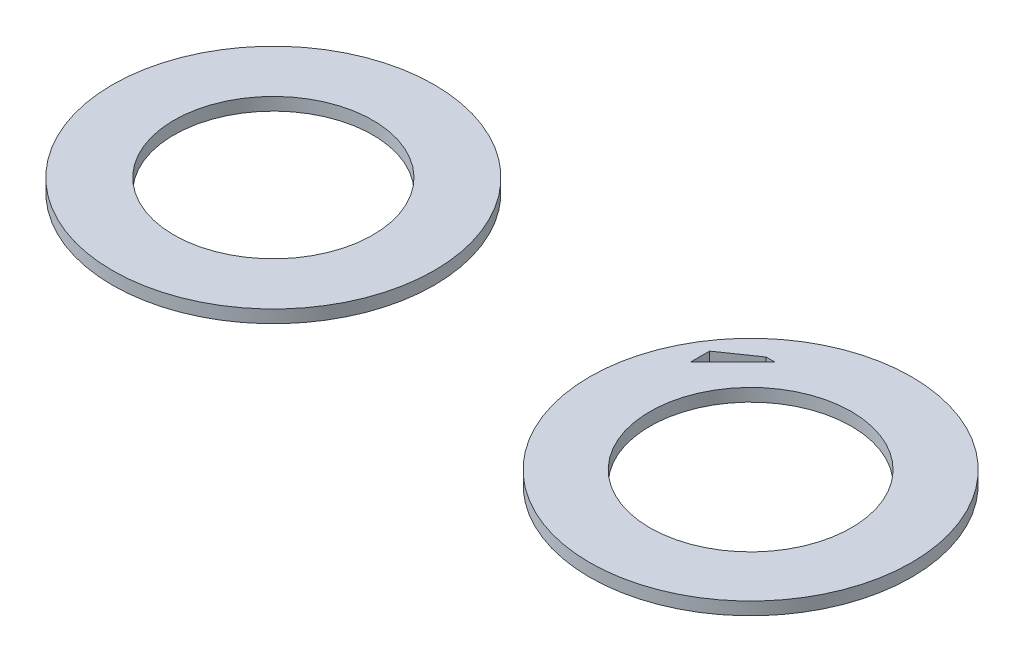
ISO-10303-21;
HEADER;
FILE_DESCRIPTION(('STEP AP214'),'2;1');
FILE_NAME('part.step','',(''),(''),'','','');
FILE_SCHEMA(('AUTOMOTIVE_DESIGN { 1 0 10303 214 1 1 1 1 }'));
ENDSEC;
DATA;
#1=APPLICATION_CONTEXT('core data for automotive mechanical design processes');
#2=APPLICATION_PROTOCOL_DEFINITION('international standard','automotive_design',2000,#1);
#3=PRODUCT_CONTEXT('',#1,'mechanical');
#4=PRODUCT('Part','Part','',(#3));
#5=PRODUCT_RELATED_PRODUCT_CATEGORY('part','',(#4));
#6=PRODUCT_DEFINITION_FORMATION('','',#4);
#7=PRODUCT_DEFINITION_CONTEXT('part definition',#1,'design');
#8=PRODUCT_DEFINITION('design','',#6,#7);
#9=PRODUCT_DEFINITION_SHAPE('','',#8);
#10=(LENGTH_UNIT() NAMED_UNIT(*) SI_UNIT(.MILLI.,.METRE.));
#11=(NAMED_UNIT(*) PLANE_ANGLE_UNIT() SI_UNIT($,.RADIAN.));
#12=(NAMED_UNIT(*) SI_UNIT($,.STERADIAN.) SOLID_ANGLE_UNIT());
#13=UNCERTAINTY_MEASURE_WITH_UNIT(LENGTH_MEASURE(1.E-05),#10,'distance_accuracy_value','');
#14=(GEOMETRIC_REPRESENTATION_CONTEXT(3) GLOBAL_UNCERTAINTY_ASSIGNED_CONTEXT((#13)) GLOBAL_UNIT_ASSIGNED_CONTEXT((#10,
#11,#12)) REPRESENTATION_CONTEXT('',''));
#15=CARTESIAN_POINT('',(0.,0.,0.));
#16=DIRECTION('',(0.,0.,1.));
#17=DIRECTION('',(1.,0.,0.));
#18=AXIS2_PLACEMENT_3D('',#15,#16,#17);
#19=CARTESIAN_POINT('',(52.3767748142269,2.5,-9.29666652388456));
#20=DIRECTION('',(0.,1.,0.));
#21=DIRECTION('',(0.,0.,1.));
#22=AXIS2_PLACEMENT_3D('',#19,#20,#21);
#23=PLANE('',#22);
#24=CARTESIAN_POINT('',(52.3767748142269,2.5,-9.29666652388456));
#25=DIRECTION('',(0.,1.,0.));
#26=DIRECTION('',(0.,0.,1.));
#27=AXIS2_PLACEMENT_3D('',#24,#25,#26);
#28=CIRCLE('',#27,31.55);
#29=CARTESIAN_POINT('',(52.3767748142269,2.5,22.2533334761154));
#30=VERTEX_POINT('',#29);
#31=EDGE_CURVE('E12',#30,#30,#28,.T.);
#32=ORIENTED_EDGE('',*,*,#31,.T.);
#33=EDGE_LOOP('',(#32));
#34=FACE_BOUND('',#33,.T.);
#35=CARTESIAN_POINT('',(52.3767748142269,2.5,-9.29666652388456));
#36=DIRECTION('',(0.,1.,0.));
#37=DIRECTION('',(0.,0.,1.));
#38=AXIS2_PLACEMENT_3D('',#35,#36,#37);
#39=CIRCLE('',#38,19.75);
#40=CARTESIAN_POINT('',(52.3767748142269,2.5,10.4533334761154));
#41=VERTEX_POINT('',#40);
#42=EDGE_CURVE('E141',#41,#41,#39,.T.);
#43=ORIENTED_EDGE('',*,*,#42,.F.);
#44=EDGE_LOOP('',(#43));
#45=FACE_BOUND('',#44,.T.);
#46=DIRECTION('',(0.,0.,1.));
#47=VECTOR('',#46,1.);
#48=CARTESIAN_POINT('',(28.2154295360468,2.5,-25.4042300426713));
#49=LINE('',#48,#47);
#50=CARTESIAN_POINT('',(28.2154295360468,2.5,-25.4042300426713));
#51=VERTEX_POINT('',#50);
#52=CARTESIAN_POINT('',(28.2154295360468,2.5,-21.6290198429557));
#53=VERTEX_POINT('',#52);
#54=EDGE_CURVE('E102',#51,#53,#49,.T.);
#55=ORIENTED_EDGE('',*,*,#54,.F.);
#56=DIRECTION('',(-0.82219219164377,0.,0.56920997883032));
#57=VECTOR('',#56,1.);
#58=CARTESIAN_POINT('',(34.7591272155539,2.5,-29.9344822823302));
#59=LINE('',#58,#57);
#60=CARTESIAN_POINT('',(34.7591272155539,2.5,-29.9344822823302));
#61=VERTEX_POINT('',#60);
#62=EDGE_CURVE('E93',#61,#51,#59,.T.);
#63=ORIENTED_EDGE('',*,*,#62,.F.);
#64=DIRECTION('',(-1.,0.,0.));
#65=VECTOR('',#64,1.);
#66=CARTESIAN_POINT('',(36.520891975421,2.5,-29.9344822823302));
#67=LINE('',#66,#65);
#68=CARTESIAN_POINT('',(36.520891975421,2.5,-29.9344822823302));
#69=VERTEX_POINT('',#68);
#70=EDGE_CURVE('E121',#69,#61,#67,.T.);
#71=ORIENTED_EDGE('',*,*,#70,.F.);
#72=DIRECTION('',(0.707106781186533,0.,-0.707106781186561));
#73=VECTOR('',#72,1.);
#74=CARTESIAN_POINT('',(28.2154295360468,2.5,-21.6290198429557));
#75=LINE('',#74,#73);
#76=EDGE_CURVE('E115',#53,#69,#75,.T.);
#77=ORIENTED_EDGE('',*,*,#76,.F.);
#78=EDGE_LOOP('',(#55,#63,#71,#77));
#79=FACE_BOUND('',#78,.T.);
#80=ADVANCED_FACE('F51',(#34,#45,#79),#23,.T.);
#81=CARTESIAN_POINT('',(52.3767748142269,0.,-9.29666652388456));
#82=DIRECTION('',(0.,1.,0.));
#83=DIRECTION('',(0.,0.,1.));
#84=AXIS2_PLACEMENT_3D('',#81,#82,#83);
#85=PLANE('',#84);
#86=CARTESIAN_POINT('',(52.3767748142269,0.,-9.29666652388456));
#87=DIRECTION('',(0.,1.,0.));
#88=DIRECTION('',(0.,0.,1.));
#89=AXIS2_PLACEMENT_3D('',#86,#87,#88);
#90=CIRCLE('',#89,19.75);
#91=CARTESIAN_POINT('',(52.3767748142269,0.,10.4533334761154));
#92=VERTEX_POINT('',#91);
#93=EDGE_CURVE('E111',#92,#92,#90,.T.);
#94=ORIENTED_EDGE('',*,*,#93,.T.);
#95=EDGE_LOOP('',(#94));
#96=FACE_BOUND('',#95,.T.);
#97=CARTESIAN_POINT('',(52.3767748142269,0.,-9.29666652388456));
#98=DIRECTION('',(0.,1.,0.));
#99=DIRECTION('',(0.,0.,1.));
#100=AXIS2_PLACEMENT_3D('',#97,#98,#99);
#101=CIRCLE('',#100,31.55);
#102=CARTESIAN_POINT('',(52.3767748142269,0.,22.2533334761154));
#103=VERTEX_POINT('',#102);
#104=EDGE_CURVE('E55',#103,#103,#101,.T.);
#105=ORIENTED_EDGE('',*,*,#104,.F.);
#106=EDGE_LOOP('',(#105));
#107=FACE_BOUND('',#106,.T.);
#108=DIRECTION('',(-0.82219219164377,0.,0.56920997883032));
#109=VECTOR('',#108,1.);
#110=CARTESIAN_POINT('',(34.7591272155539,0.,-29.9344822823302));
#111=LINE('',#110,#109);
#112=CARTESIAN_POINT('',(34.7591272155539,0.,-29.9344822823302));
#113=VERTEX_POINT('',#112);
#114=CARTESIAN_POINT('',(28.2154295360468,0.,-25.4042300426713));
#115=VERTEX_POINT('',#114);
#116=EDGE_CURVE('E75',#113,#115,#111,.T.);
#117=ORIENTED_EDGE('',*,*,#116,.T.);
#118=DIRECTION('',(0.,0.,1.));
#119=VECTOR('',#118,1.);
#120=CARTESIAN_POINT('',(28.2154295360468,0.,-25.4042300426713));
#121=LINE('',#120,#119);
#122=CARTESIAN_POINT('',(28.2154295360468,0.,-21.6290198429557));
#123=VERTEX_POINT('',#122);
#124=EDGE_CURVE('E109',#115,#123,#121,.T.);
#125=ORIENTED_EDGE('',*,*,#124,.T.);
#126=DIRECTION('',(0.707106781186533,0.,-0.707106781186561));
#127=VECTOR('',#126,1.);
#128=CARTESIAN_POINT('',(28.2154295360468,0.,-21.6290198429557));
#129=LINE('',#128,#127);
#130=CARTESIAN_POINT('',(36.520891975421,0.,-29.9344822823302));
#131=VERTEX_POINT('',#130);
#132=EDGE_CURVE('E130',#123,#131,#129,.T.);
#133=ORIENTED_EDGE('',*,*,#132,.T.);
#134=DIRECTION('',(-1.,0.,0.));
#135=VECTOR('',#134,1.);
#136=CARTESIAN_POINT('',(36.520891975421,0.,-29.9344822823302));
#137=LINE('',#136,#135);
#138=EDGE_CURVE('E103',#131,#113,#137,.T.);
#139=ORIENTED_EDGE('',*,*,#138,.T.);
#140=EDGE_LOOP('',(#117,#125,#133,#139));
#141=FACE_BOUND('',#140,.T.);
#142=ADVANCED_FACE('F149',(#96,#107,#141),#85,.F.);
#143=CARTESIAN_POINT('',(52.3767748142269,2.5,-9.29666652388456));
#144=DIRECTION('',(0.,-1.,0.));
#145=DIRECTION('',(0.,0.,-1.));
#146=AXIS2_PLACEMENT_3D('',#143,#144,#145);
#147=CYLINDRICAL_SURFACE('',#146,31.55);
#148=ORIENTED_EDGE('',*,*,#31,.F.);
#149=EDGE_LOOP('',(#148));
#150=FACE_BOUND('',#149,.T.);
#151=ORIENTED_EDGE('',*,*,#104,.T.);
#152=EDGE_LOOP('',(#151));
#153=FACE_BOUND('',#152,.T.);
#154=ADVANCED_FACE('F53',(#150,#153),#147,.T.);
#155=CARTESIAN_POINT('',(52.3767748142269,2.5,-9.29666652388456));
#156=DIRECTION('',(0.,-1.,0.));
#157=DIRECTION('',(0.,0.,-1.));
#158=AXIS2_PLACEMENT_3D('',#155,#156,#157);
#159=CYLINDRICAL_SURFACE('',#158,19.75);
#160=ORIENTED_EDGE('',*,*,#42,.T.);
#161=EDGE_LOOP('',(#160));
#162=FACE_BOUND('',#161,.T.);
#163=ORIENTED_EDGE('',*,*,#93,.F.);
#164=EDGE_LOOP('',(#163));
#165=FACE_BOUND('',#164,.T.);
#166=ADVANCED_FACE('F152',(#162,#165),#159,.F.);
#167=CARTESIAN_POINT('',(34.7591272155539,2.5,-29.9344822823302));
#168=DIRECTION('',(0.56920997883032,0.,0.82219219164377));
#169=DIRECTION('',(0.82219219164377,0.,-0.56920997883032));
#170=AXIS2_PLACEMENT_3D('',#167,#168,#169);
#171=PLANE('',#170);
#172=ORIENTED_EDGE('',*,*,#116,.F.);
#173=DIRECTION('',(0.,-1.,0.));
#174=VECTOR('',#173,1.);
#175=CARTESIAN_POINT('',(34.7591272155539,2.5,-29.9344822823302));
#176=LINE('',#175,#174);
#177=EDGE_CURVE('E97',#61,#113,#176,.T.);
#178=ORIENTED_EDGE('',*,*,#177,.F.);
#179=ORIENTED_EDGE('',*,*,#62,.T.);
#180=DIRECTION('',(0.,-1.,0.));
#181=VECTOR('',#180,1.);
#182=CARTESIAN_POINT('',(28.2154295360468,2.5,-25.4042300426713));
#183=LINE('',#182,#181);
#184=EDGE_CURVE('E96',#51,#115,#183,.T.);
#185=ORIENTED_EDGE('',*,*,#184,.T.);
#186=EDGE_LOOP('',(#172,#178,#179,#185));
#187=FACE_BOUND('',#186,.T.);
#188=ADVANCED_FACE('F95',(#187),#171,.T.);
#189=CARTESIAN_POINT('',(28.2154295360468,2.5,-25.4042300426713));
#190=DIRECTION('',(1.,0.,0.));
#191=DIRECTION('',(0.,0.,-1.));
#192=AXIS2_PLACEMENT_3D('',#189,#190,#191);
#193=PLANE('',#192);
#194=ORIENTED_EDGE('',*,*,#124,.F.);
#195=ORIENTED_EDGE('',*,*,#184,.F.);
#196=ORIENTED_EDGE('',*,*,#54,.T.);
#197=DIRECTION('',(0.,-1.,0.));
#198=VECTOR('',#197,1.);
#199=CARTESIAN_POINT('',(28.2154295360468,2.5,-21.6290198429557));
#200=LINE('',#199,#198);
#201=EDGE_CURVE('E112',#53,#123,#200,.T.);
#202=ORIENTED_EDGE('',*,*,#201,.T.);
#203=EDGE_LOOP('',(#194,#195,#196,#202));
#204=FACE_BOUND('',#203,.T.);
#205=ADVANCED_FACE('F106',(#204),#193,.T.);
#206=CARTESIAN_POINT('',(28.2154295360468,2.5,-21.6290198429557));
#207=DIRECTION('',(-0.707106781186561,0.,-0.707106781186533));
#208=DIRECTION('',(-0.707106781186534,0.,0.707106781186562));
#209=AXIS2_PLACEMENT_3D('',#206,#207,#208);
#210=PLANE('',#209);
#211=ORIENTED_EDGE('',*,*,#132,.F.);
#212=ORIENTED_EDGE('',*,*,#201,.F.);
#213=ORIENTED_EDGE('',*,*,#76,.T.);
#214=DIRECTION('',(0.,-1.,0.));
#215=VECTOR('',#214,1.);
#216=CARTESIAN_POINT('',(36.520891975421,2.5,-29.9344822823302));
#217=LINE('',#216,#215);
#218=EDGE_CURVE('E67',#69,#131,#217,.T.);
#219=ORIENTED_EDGE('',*,*,#218,.T.);
#220=EDGE_LOOP('',(#211,#212,#213,#219));
#221=FACE_BOUND('',#220,.T.);
#222=ADVANCED_FACE('F177',(#221),#210,.T.);
#223=CARTESIAN_POINT('',(36.520891975421,2.5,-29.9344822823302));
#224=DIRECTION('',(0.,0.,1.));
#225=DIRECTION('',(1.,0.,0.));
#226=AXIS2_PLACEMENT_3D('',#223,#224,#225);
#227=PLANE('',#226);
#228=ORIENTED_EDGE('',*,*,#138,.F.);
#229=ORIENTED_EDGE('',*,*,#218,.F.);
#230=ORIENTED_EDGE('',*,*,#70,.T.);
#231=ORIENTED_EDGE('',*,*,#177,.T.);
#232=EDGE_LOOP('',(#228,#229,#230,#231));
#233=FACE_BOUND('',#232,.T.);
#234=ADVANCED_FACE('F175',(#233),#227,.T.);
#235=CLOSED_SHELL('',(#80,#142,#154,#166,#188,#205,#222,#234));
#236=MANIFOLD_SOLID_BREP('B2',#235);
#237=CARTESIAN_POINT('',(-43.9915195848477,2.5,-12.0986888501424));
#238=DIRECTION('',(0.,1.,0.));
#239=DIRECTION('',(0.,0.,1.));
#240=AXIS2_PLACEMENT_3D('',#237,#238,#239);
#241=PLANE('',#240);
#242=CARTESIAN_POINT('',(-43.9915195848477,2.5,-12.0986888501424));
#243=DIRECTION('',(0.,1.,0.));
#244=DIRECTION('',(0.,0.,1.));
#245=AXIS2_PLACEMENT_3D('',#242,#243,#244);
#246=CIRCLE('',#245,31.55);
#247=CARTESIAN_POINT('',(-43.9915195848477,2.5,19.4513111498576));
#248=VERTEX_POINT('',#247);
#249=EDGE_CURVE('E50',#248,#248,#246,.T.);
#250=ORIENTED_EDGE('',*,*,#249,.T.);
#251=EDGE_LOOP('',(#250));
#252=FACE_BOUND('',#251,.T.);
#253=CARTESIAN_POINT('',(-43.9915195848477,2.5,-12.0986888501424));
#254=DIRECTION('',(0.,1.,0.));
#255=DIRECTION('',(0.,0.,1.));
#256=AXIS2_PLACEMENT_3D('',#253,#254,#255);
#257=CIRCLE('',#256,19.5);
#258=CARTESIAN_POINT('',(-43.9915195848477,2.5,7.40131114985765));
#259=VERTEX_POINT('',#258);
#260=EDGE_CURVE('E255',#259,#259,#257,.T.);
#261=ORIENTED_EDGE('',*,*,#260,.F.);
#262=EDGE_LOOP('',(#261));
#263=FACE_BOUND('',#262,.T.);
#264=ADVANCED_FACE('F241',(#252,#263),#241,.T.);
#265=CARTESIAN_POINT('',(-43.9915195848477,0.,-12.0986888501424));
#266=DIRECTION('',(0.,1.,0.));
#267=DIRECTION('',(0.,0.,1.));
#268=AXIS2_PLACEMENT_3D('',#265,#266,#267);
#269=PLANE('',#268);
#270=CARTESIAN_POINT('',(-43.9915195848477,0.,-12.0986888501424));
#271=DIRECTION('',(0.,1.,0.));
#272=DIRECTION('',(0.,0.,1.));
#273=AXIS2_PLACEMENT_3D('',#270,#271,#272);
#274=CIRCLE('',#273,31.55);
#275=CARTESIAN_POINT('',(-43.9915195848477,0.,19.4513111498576));
#276=VERTEX_POINT('',#275);
#277=EDGE_CURVE('E245',#276,#276,#274,.T.);
#278=ORIENTED_EDGE('',*,*,#277,.F.);
#279=EDGE_LOOP('',(#278));
#280=FACE_BOUND('',#279,.T.);
#281=CARTESIAN_POINT('',(-43.9915195848477,0.,-12.0986888501424));
#282=DIRECTION('',(0.,1.,0.));
#283=DIRECTION('',(0.,0.,1.));
#284=AXIS2_PLACEMENT_3D('',#281,#282,#283);
#285=CIRCLE('',#284,19.5);
#286=CARTESIAN_POINT('',(-43.9915195848477,0.,7.40131114985765));
#287=VERTEX_POINT('',#286);
#288=EDGE_CURVE('E257',#287,#287,#285,.T.);
#289=ORIENTED_EDGE('',*,*,#288,.T.);
#290=EDGE_LOOP('',(#289));
#291=FACE_BOUND('',#290,.T.);
#292=ADVANCED_FACE('F268',(#280,#291),#269,.F.);
#293=CARTESIAN_POINT('',(-43.9915195848477,2.5,-12.0986888501424));
#294=DIRECTION('',(0.,-1.,0.));
#295=DIRECTION('',(0.,0.,-1.));
#296=AXIS2_PLACEMENT_3D('',#293,#294,#295);
#297=CYLINDRICAL_SURFACE('',#296,31.55);
#298=ORIENTED_EDGE('',*,*,#249,.F.);
#299=EDGE_LOOP('',(#298));
#300=FACE_BOUND('',#299,.T.);
#301=ORIENTED_EDGE('',*,*,#277,.T.);
#302=EDGE_LOOP('',(#301));
#303=FACE_BOUND('',#302,.T.);
#304=ADVANCED_FACE('F243',(#300,#303),#297,.T.);
#305=CARTESIAN_POINT('',(-43.9915195848477,2.5,-12.0986888501424));
#306=DIRECTION('',(0.,-1.,0.));
#307=DIRECTION('',(0.,0.,-1.));
#308=AXIS2_PLACEMENT_3D('',#305,#306,#307);
#309=CYLINDRICAL_SURFACE('',#308,19.5);
#310=ORIENTED_EDGE('',*,*,#260,.T.);
#311=EDGE_LOOP('',(#310));
#312=FACE_BOUND('',#311,.T.);
#313=ORIENTED_EDGE('',*,*,#288,.F.);
#314=EDGE_LOOP('',(#313));
#315=FACE_BOUND('',#314,.T.);
#316=ADVANCED_FACE('F264',(#312,#315),#309,.F.);
#317=CLOSED_SHELL('',(#264,#292,#304,#316));
#318=MANIFOLD_SOLID_BREP('B6',#317);
#319=ADVANCED_BREP_SHAPE_REPRESENTATION('',(#18,#236,#318),#14);
#320=SHAPE_DEFINITION_REPRESENTATION(#9,#319);
ENDSEC;
END-ISO-10303-21;
